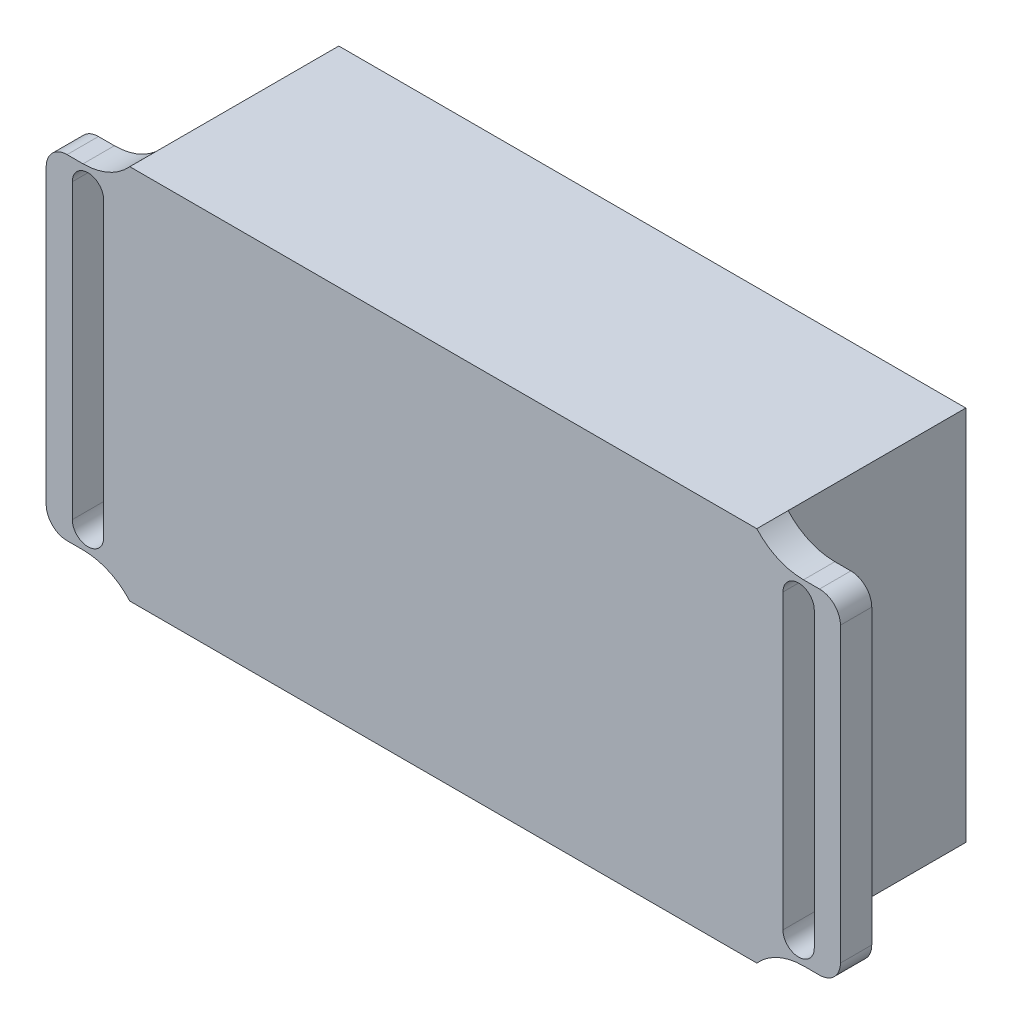
ISO-10303-21;
HEADER;
FILE_DESCRIPTION(('STEP AP214'),'2;1');
FILE_NAME('part.step','',(''),(''),'','','');
FILE_SCHEMA(('AUTOMOTIVE_DESIGN { 1 0 10303 214 1 1 1 1 }'));
ENDSEC;
DATA;
#1=APPLICATION_CONTEXT('core data for automotive mechanical design processes');
#2=APPLICATION_PROTOCOL_DEFINITION('international standard','automotive_design',2000,#1);
#3=PRODUCT_CONTEXT('',#1,'mechanical');
#4=PRODUCT('Part','Part','',(#3));
#5=PRODUCT_RELATED_PRODUCT_CATEGORY('part','',(#4));
#6=PRODUCT_DEFINITION_FORMATION('','',#4);
#7=PRODUCT_DEFINITION_CONTEXT('part definition',#1,'design');
#8=PRODUCT_DEFINITION('design','',#6,#7);
#9=PRODUCT_DEFINITION_SHAPE('','',#8);
#10=(LENGTH_UNIT() NAMED_UNIT(*) SI_UNIT(.MILLI.,.METRE.));
#11=(NAMED_UNIT(*) PLANE_ANGLE_UNIT() SI_UNIT($,.RADIAN.));
#12=(NAMED_UNIT(*) SI_UNIT($,.STERADIAN.) SOLID_ANGLE_UNIT());
#13=UNCERTAINTY_MEASURE_WITH_UNIT(LENGTH_MEASURE(1.E-05),#10,'distance_accuracy_value','');
#14=(GEOMETRIC_REPRESENTATION_CONTEXT(3) GLOBAL_UNCERTAINTY_ASSIGNED_CONTEXT((#13)) GLOBAL_UNIT_ASSIGNED_CONTEXT((#10,
#11,#12)) REPRESENTATION_CONTEXT('',''));
#15=CARTESIAN_POINT('',(0.,0.,0.));
#16=DIRECTION('',(0.,0.,1.));
#17=DIRECTION('',(1.,0.,0.));
#18=AXIS2_PLACEMENT_3D('',#15,#16,#17);
#19=CARTESIAN_POINT('',(0.,0.,0.));
#20=DIRECTION('',(0.,0.,1.));
#21=DIRECTION('',(1.,0.,0.));
#22=AXIS2_PLACEMENT_3D('',#19,#20,#21);
#23=PLANE('',#22);
#24=CARTESIAN_POINT('',(5.,0.,0.));
#25=DIRECTION('',(0.,0.,-1.));
#26=DIRECTION('',(1.,0.,0.));
#27=AXIS2_PLACEMENT_3D('',#24,#25,#26);
#28=CIRCLE('',#27,1.);
#29=CARTESIAN_POINT('',(6.,0.,0.));
#30=VERTEX_POINT('',#29);
#31=EDGE_CURVE('E399',#30,#30,#28,.T.);
#32=ORIENTED_EDGE('',*,*,#31,.F.);
#33=EDGE_LOOP('',(#32));
#34=FACE_BOUND('',#33,.T.);
#35=CARTESIAN_POINT('',(-5.,0.,0.));
#36=DIRECTION('',(0.,0.,-1.));
#37=DIRECTION('',(1.,0.,0.));
#38=AXIS2_PLACEMENT_3D('',#35,#36,#37);
#39=CIRCLE('',#38,1.);
#40=CARTESIAN_POINT('',(-4.,0.,0.));
#41=VERTEX_POINT('',#40);
#42=EDGE_CURVE('E393',#41,#41,#39,.T.);
#43=ORIENTED_EDGE('',*,*,#42,.F.);
#44=EDGE_LOOP('',(#43));
#45=FACE_BOUND('',#44,.T.);
#46=CARTESIAN_POINT('',(0.,0.,0.));
#47=DIRECTION('',(0.,0.,-1.));
#48=DIRECTION('',(1.,0.,0.));
#49=AXIS2_PLACEMENT_3D('',#46,#47,#48);
#50=CIRCLE('',#49,1.);
#51=CARTESIAN_POINT('',(1.,0.,0.));
#52=VERTEX_POINT('',#51);
#53=EDGE_CURVE('E394',#52,#52,#50,.T.);
#54=ORIENTED_EDGE('',*,*,#53,.F.);
#55=EDGE_LOOP('',(#54));
#56=FACE_BOUND('',#55,.T.);
#57=DIRECTION('',(1.,0.,0.));
#58=VECTOR('',#57,1.);
#59=CARTESIAN_POINT('',(6.,-18.,0.));
#60=LINE('',#59,#58);
#61=CARTESIAN_POINT('',(-30.,-18.,0.));
#62=VERTEX_POINT('',#61);
#63=CARTESIAN_POINT('',(30.,-18.,0.));
#64=VERTEX_POINT('',#63);
#65=EDGE_CURVE('E389',#62,#64,#60,.T.);
#66=ORIENTED_EDGE('',*,*,#65,.F.);
#67=DIRECTION('',(0.,-1.,0.));
#68=VECTOR('',#67,1.);
#69=CARTESIAN_POINT('',(-30.,-18.,0.));
#70=LINE('',#69,#68);
#71=CARTESIAN_POINT('',(-30.,18.,0.));
#72=VERTEX_POINT('',#71);
#73=EDGE_CURVE('E377',#72,#62,#70,.T.);
#74=ORIENTED_EDGE('',*,*,#73,.F.);
#75=DIRECTION('',(-1.,0.,0.));
#76=VECTOR('',#75,1.);
#77=CARTESIAN_POINT('',(-6.,18.,0.));
#78=LINE('',#77,#76);
#79=CARTESIAN_POINT('',(30.,18.,0.));
#80=VERTEX_POINT('',#79);
#81=EDGE_CURVE('E391',#80,#72,#78,.T.);
#82=ORIENTED_EDGE('',*,*,#81,.F.);
#83=DIRECTION('',(0.,1.,0.));
#84=VECTOR('',#83,1.);
#85=CARTESIAN_POINT('',(30.,18.,0.));
#86=LINE('',#85,#84);
#87=EDGE_CURVE('E365',#64,#80,#86,.T.);
#88=ORIENTED_EDGE('',*,*,#87,.F.);
#89=EDGE_LOOP('',(#66,#74,#82,#88));
#90=FACE_BOUND('',#89,.T.);
#91=ADVANCED_FACE('F49',(#34,#45,#56,#90),#23,.F.);
#92=CARTESIAN_POINT('',(5.,0.,0.));
#93=DIRECTION('',(0.,0.,-1.));
#94=DIRECTION('',(-1.,-6.080797825879E-09,0.));
#95=AXIS2_PLACEMENT_3D('',#92,#93,#94);
#96=SPHERICAL_SURFACE('',#95,1.);
#97=ORIENTED_EDGE('',*,*,#31,.T.);
#98=EDGE_LOOP('',(#97));
#99=FACE_BOUND('',#98,.T.);
#100=ADVANCED_FACE('F774',(#99),#96,.T.);
#101=CARTESIAN_POINT('',(0.,0.,0.));
#102=DIRECTION('',(0.,0.,-1.));
#103=DIRECTION('',(-1.,-6.080797832818E-09,0.));
#104=AXIS2_PLACEMENT_3D('',#101,#102,#103);
#105=SPHERICAL_SURFACE('',#104,1.);
#106=ORIENTED_EDGE('',*,*,#53,.T.);
#107=EDGE_LOOP('',(#106));
#108=FACE_BOUND('',#107,.T.);
#109=ADVANCED_FACE('F780',(#108),#105,.T.);
#110=CARTESIAN_POINT('',(-5.,0.,0.));
#111=DIRECTION('',(0.,0.,-1.));
#112=DIRECTION('',(-1.,-6.080797763426E-09,0.));
#113=AXIS2_PLACEMENT_3D('',#110,#111,#112);
#114=SPHERICAL_SURFACE('',#113,1.);
#115=ORIENTED_EDGE('',*,*,#42,.T.);
#116=EDGE_LOOP('',(#115));
#117=FACE_BOUND('',#116,.T.);
#118=ADVANCED_FACE('F788',(#117),#114,.T.);
#119=CARTESIAN_POINT('',(0.,18.,0.));
#120=DIRECTION('',(0.,-1.,0.));
#121=DIRECTION('',(0.,0.,-1.));
#122=AXIS2_PLACEMENT_3D('',#119,#120,#121);
#123=PLANE('',#122);
#124=ORIENTED_EDGE('',*,*,#81,.T.);
#125=DIRECTION('',(0.,0.,-1.));
#126=VECTOR('',#125,1.);
#127=CARTESIAN_POINT('',(-30.,18.,0.));
#128=LINE('',#127,#126);
#129=CARTESIAN_POINT('',(-30.,18.,17.));
#130=VERTEX_POINT('',#129);
#131=EDGE_CURVE('E386',#130,#72,#128,.T.);
#132=ORIENTED_EDGE('',*,*,#131,.F.);
#133=DIRECTION('',(0.,0.,-1.));
#134=VECTOR('',#133,1.);
#135=CARTESIAN_POINT('',(-30.,18.,20.));
#136=LINE('',#135,#134);
#137=CARTESIAN_POINT('',(-30.,18.,20.));
#138=VERTEX_POINT('',#137);
#139=EDGE_CURVE('E318',#138,#130,#136,.T.);
#140=ORIENTED_EDGE('',*,*,#139,.F.);
#141=DIRECTION('',(-1.,0.,0.));
#142=VECTOR('',#141,1.);
#143=CARTESIAN_POINT('',(-30.,18.,20.));
#144=LINE('',#143,#142);
#145=CARTESIAN_POINT('',(30.0000000000001,18.0000000000001,20.));
#146=VERTEX_POINT('',#145);
#147=EDGE_CURVE('E316',#146,#138,#144,.T.);
#148=ORIENTED_EDGE('',*,*,#147,.F.);
#149=DIRECTION('',(0.,0.,-1.));
#150=VECTOR('',#149,1.);
#151=CARTESIAN_POINT('',(30.0000000000001,18.0000000000001,20.));
#152=LINE('',#151,#150);
#153=CARTESIAN_POINT('',(30.0000000000001,18.0000000000001,17.));
#154=VERTEX_POINT('',#153);
#155=EDGE_CURVE('E344',#146,#154,#152,.T.);
#156=ORIENTED_EDGE('',*,*,#155,.T.);
#157=DIRECTION('',(0.,0.,1.));
#158=VECTOR('',#157,1.);
#159=CARTESIAN_POINT('',(30.,18.,17.));
#160=LINE('',#159,#158);
#161=EDGE_CURVE('E368',#80,#154,#160,.T.);
#162=ORIENTED_EDGE('',*,*,#161,.F.);
#163=EDGE_LOOP('',(#124,#132,#140,#148,#156,#162));
#164=FACE_BOUND('',#163,.T.);
#165=ADVANCED_FACE('F790',(#164),#123,.F.);
#166=CARTESIAN_POINT('',(0.,-18.,0.));
#167=DIRECTION('',(0.,1.,0.));
#168=DIRECTION('',(0.,0.,1.));
#169=AXIS2_PLACEMENT_3D('',#166,#167,#168);
#170=PLANE('',#169);
#171=DIRECTION('',(0.,0.,-1.));
#172=VECTOR('',#171,1.);
#173=CARTESIAN_POINT('',(30.,-18.,0.));
#174=LINE('',#173,#172);
#175=CARTESIAN_POINT('',(30.,-18.,17.));
#176=VERTEX_POINT('',#175);
#177=EDGE_CURVE('E374',#176,#64,#174,.T.);
#178=ORIENTED_EDGE('',*,*,#177,.F.);
#179=DIRECTION('',(0.,0.,-1.));
#180=VECTOR('',#179,1.);
#181=CARTESIAN_POINT('',(30.,-18.,20.));
#182=LINE('',#181,#180);
#183=CARTESIAN_POINT('',(30.,-18.,20.));
#184=VERTEX_POINT('',#183);
#185=EDGE_CURVE('E353',#184,#176,#182,.T.);
#186=ORIENTED_EDGE('',*,*,#185,.F.);
#187=DIRECTION('',(1.,0.,0.));
#188=VECTOR('',#187,1.);
#189=CARTESIAN_POINT('',(30.,-18.,20.));
#190=LINE('',#189,#188);
#191=CARTESIAN_POINT('',(-30.0000000000001,-18.0000000000001,20.));
#192=VERTEX_POINT('',#191);
#193=EDGE_CURVE('E302',#192,#184,#190,.T.);
#194=ORIENTED_EDGE('',*,*,#193,.F.);
#195=DIRECTION('',(0.,0.,-1.));
#196=VECTOR('',#195,1.);
#197=CARTESIAN_POINT('',(-30.0000000000001,-18.0000000000001,20.));
#198=LINE('',#197,#196);
#199=CARTESIAN_POINT('',(-30.0000000000001,-18.0000000000001,17.));
#200=VERTEX_POINT('',#199);
#201=EDGE_CURVE('E356',#192,#200,#198,.T.);
#202=ORIENTED_EDGE('',*,*,#201,.T.);
#203=DIRECTION('',(0.,0.,1.));
#204=VECTOR('',#203,1.);
#205=CARTESIAN_POINT('',(-30.,-18.,17.));
#206=LINE('',#205,#204);
#207=EDGE_CURVE('E380',#62,#200,#206,.T.);
#208=ORIENTED_EDGE('',*,*,#207,.F.);
#209=ORIENTED_EDGE('',*,*,#65,.T.);
#210=EDGE_LOOP('',(#178,#186,#194,#202,#208,#209));
#211=FACE_BOUND('',#210,.T.);
#212=ADVANCED_FACE('F740',(#211),#170,.F.);
#213=CARTESIAN_POINT('',(-30.,0.,0.));
#214=DIRECTION('',(1.,0.,0.));
#215=DIRECTION('',(0.,0.,-1.));
#216=AXIS2_PLACEMENT_3D('',#213,#214,#215);
#217=PLANE('',#216);
#218=ORIENTED_EDGE('',*,*,#73,.T.);
#219=ORIENTED_EDGE('',*,*,#207,.T.);
#220=DIRECTION('',(0.,1.,0.));
#221=VECTOR('',#220,1.);
#222=CARTESIAN_POINT('',(-30.,18.,17.));
#223=LINE('',#222,#221);
#224=EDGE_CURVE('E383',#200,#130,#223,.T.);
#225=ORIENTED_EDGE('',*,*,#224,.T.);
#226=ORIENTED_EDGE('',*,*,#131,.T.);
#227=EDGE_LOOP('',(#218,#219,#225,#226));
#228=FACE_BOUND('',#227,.T.);
#229=ADVANCED_FACE('F1016',(#228),#217,.F.);
#230=CARTESIAN_POINT('',(30.,0.,0.));
#231=DIRECTION('',(-1.,0.,0.));
#232=DIRECTION('',(0.,0.,1.));
#233=AXIS2_PLACEMENT_3D('',#230,#231,#232);
#234=PLANE('',#233);
#235=ORIENTED_EDGE('',*,*,#87,.T.);
#236=ORIENTED_EDGE('',*,*,#161,.T.);
#237=DIRECTION('',(0.,-1.,0.));
#238=VECTOR('',#237,1.);
#239=CARTESIAN_POINT('',(30.,-18.,17.));
#240=LINE('',#239,#238);
#241=EDGE_CURVE('E371',#154,#176,#240,.T.);
#242=ORIENTED_EDGE('',*,*,#241,.T.);
#243=ORIENTED_EDGE('',*,*,#177,.T.);
#244=EDGE_LOOP('',(#235,#236,#242,#243));
#245=FACE_BOUND('',#244,.T.);
#246=ADVANCED_FACE('F1006',(#245),#234,.F.);
#247=CARTESIAN_POINT('',(-34.472135955,22.,17.));
#248=DIRECTION('',(0.,0.,1.));
#249=DIRECTION('',(1.,0.,0.));
#250=AXIS2_PLACEMENT_3D('',#247,#248,#249);
#251=PLANE('',#250);
#252=DIRECTION('',(0.,-1.,0.));
#253=VECTOR('',#252,1.);
#254=CARTESIAN_POINT('',(-35.5,22.,17.));
#255=LINE('',#254,#253);
#256=CARTESIAN_POINT('',(-35.5,14.,17.));
#257=VERTEX_POINT('',#256);
#258=CARTESIAN_POINT('',(-35.5,-14.,17.));
#259=VERTEX_POINT('',#258);
#260=EDGE_CURVE('E261',#257,#259,#255,.T.);
#261=ORIENTED_EDGE('',*,*,#260,.T.);
#262=CARTESIAN_POINT('',(-34.,-14.,17.));
#263=DIRECTION('',(0.,0.,1.));
#264=DIRECTION('',(1.,0.,0.));
#265=AXIS2_PLACEMENT_3D('',#262,#263,#264);
#266=CIRCLE('',#265,1.5);
#267=CARTESIAN_POINT('',(-32.5,-14.,17.));
#268=VERTEX_POINT('',#267);
#269=EDGE_CURVE('E264',#259,#268,#266,.T.);
#270=ORIENTED_EDGE('',*,*,#269,.T.);
#271=DIRECTION('',(0.,1.,0.));
#272=VECTOR('',#271,1.);
#273=CARTESIAN_POINT('',(-32.5,22.,17.));
#274=LINE('',#273,#272);
#275=CARTESIAN_POINT('',(-32.5,14.,17.));
#276=VERTEX_POINT('',#275);
#277=EDGE_CURVE('E256',#268,#276,#274,.T.);
#278=ORIENTED_EDGE('',*,*,#277,.T.);
#279=CARTESIAN_POINT('',(-34.,14.,17.));
#280=DIRECTION('',(0.,0.,1.));
#281=DIRECTION('',(1.,0.,0.));
#282=AXIS2_PLACEMENT_3D('',#279,#280,#281);
#283=CIRCLE('',#282,1.5);
#284=EDGE_CURVE('E231',#276,#257,#283,.T.);
#285=ORIENTED_EDGE('',*,*,#284,.T.);
#286=EDGE_LOOP('',(#261,#270,#278,#285));
#287=FACE_BOUND('',#286,.T.);
#288=DIRECTION('',(1.,0.,0.));
#289=VECTOR('',#288,1.);
#290=CARTESIAN_POINT('',(-34.472135955,-16.,17.));
#291=LINE('',#290,#289);
#292=CARTESIAN_POINT('',(-36.,-16.,17.));
#293=VERTEX_POINT('',#292);
#294=CARTESIAN_POINT('',(-34.472135955,-16.,17.));
#295=VERTEX_POINT('',#294);
#296=EDGE_CURVE('E327',#293,#295,#291,.T.);
#297=ORIENTED_EDGE('',*,*,#296,.F.);
#298=CARTESIAN_POINT('',(-36.,-14.,17.));
#299=DIRECTION('',(0.,0.,1.));
#300=DIRECTION('',(1.,0.,0.));
#301=AXIS2_PLACEMENT_3D('',#298,#299,#300);
#302=CIRCLE('',#301,2.);
#303=CARTESIAN_POINT('',(-38.,-14.,17.));
#304=VERTEX_POINT('',#303);
#305=EDGE_CURVE('E681',#293,#304,#302,.F.);
#306=ORIENTED_EDGE('',*,*,#305,.T.);
#307=DIRECTION('',(0.,-1.,0.));
#308=VECTOR('',#307,1.);
#309=CARTESIAN_POINT('',(-38.,-16.,17.));
#310=LINE('',#309,#308);
#311=CARTESIAN_POINT('',(-38.,14.,17.));
#312=VERTEX_POINT('',#311);
#313=EDGE_CURVE('E324',#312,#304,#310,.T.);
#314=ORIENTED_EDGE('',*,*,#313,.F.);
#315=CARTESIAN_POINT('',(-36.,14.,17.));
#316=DIRECTION('',(0.,0.,1.));
#317=DIRECTION('',(1.,0.,0.));
#318=AXIS2_PLACEMENT_3D('',#315,#316,#317);
#319=CIRCLE('',#318,2.);
#320=CARTESIAN_POINT('',(-36.,16.,17.));
#321=VERTEX_POINT('',#320);
#322=EDGE_CURVE('E679',#312,#321,#319,.F.);
#323=ORIENTED_EDGE('',*,*,#322,.T.);
#324=DIRECTION('',(-1.,0.,0.));
#325=VECTOR('',#324,1.);
#326=CARTESIAN_POINT('',(-38.,16.,17.));
#327=LINE('',#326,#325);
#328=CARTESIAN_POINT('',(-34.472135955,16.,17.));
#329=VERTEX_POINT('',#328);
#330=EDGE_CURVE('E321',#329,#321,#327,.T.);
#331=ORIENTED_EDGE('',*,*,#330,.F.);
#332=CARTESIAN_POINT('',(-34.472135955,22.,17.));
#333=DIRECTION('',(0.,0.,-1.));
#334=DIRECTION('',(1.,0.,0.));
#335=AXIS2_PLACEMENT_3D('',#332,#333,#334);
#336=CIRCLE('',#335,6.00000000000015);
#337=EDGE_CURVE('E281',#130,#329,#336,.T.);
#338=ORIENTED_EDGE('',*,*,#337,.F.);
#339=ORIENTED_EDGE('',*,*,#224,.F.);
#340=CARTESIAN_POINT('',(-34.472135955,-22.,17.));
#341=DIRECTION('',(0.,0.,-1.));
#342=DIRECTION('',(1.,0.,0.));
#343=AXIS2_PLACEMENT_3D('',#340,#341,#342);
#344=CIRCLE('',#343,6.00000000000015);
#345=EDGE_CURVE('E329',#295,#200,#344,.T.);
#346=ORIENTED_EDGE('',*,*,#345,.F.);
#347=EDGE_LOOP('',(#297,#306,#314,#323,#331,#338,#339,#346));
#348=FACE_BOUND('',#347,.T.);
#349=ADVANCED_FACE('F721',(#287,#348),#251,.F.);
#350=CARTESIAN_POINT('',(-34.472135955,22.,20.));
#351=DIRECTION('',(0.,0.,-1.));
#352=DIRECTION('',(-1.,0.,0.));
#353=AXIS2_PLACEMENT_3D('',#350,#351,#352);
#354=CYLINDRICAL_SURFACE('',#353,6.00000000000015);
#355=ORIENTED_EDGE('',*,*,#337,.T.);
#356=DIRECTION('',(0.,0.,-1.));
#357=VECTOR('',#356,1.);
#358=CARTESIAN_POINT('',(-34.472135955,16.,20.));
#359=LINE('',#358,#357);
#360=CARTESIAN_POINT('',(-34.472135955,16.,20.));
#361=VERTEX_POINT('',#360);
#362=EDGE_CURVE('E362',#361,#329,#359,.T.);
#363=ORIENTED_EDGE('',*,*,#362,.F.);
#364=CARTESIAN_POINT('',(-34.472135955,22.,20.));
#365=DIRECTION('',(0.,0.,-1.));
#366=DIRECTION('',(1.,0.,0.));
#367=AXIS2_PLACEMENT_3D('',#364,#365,#366);
#368=CIRCLE('',#367,6.00000000000015);
#369=EDGE_CURVE('E288',#138,#361,#368,.T.);
#370=ORIENTED_EDGE('',*,*,#369,.F.);
#371=ORIENTED_EDGE('',*,*,#139,.T.);
#372=EDGE_LOOP('',(#355,#363,#370,#371));
#373=FACE_BOUND('',#372,.T.);
#374=ADVANCED_FACE('F988',(#373),#354,.F.);
#375=CARTESIAN_POINT('',(-38.,16.,20.));
#376=DIRECTION('',(0.,-1.,0.));
#377=DIRECTION('',(0.,0.,-1.));
#378=AXIS2_PLACEMENT_3D('',#375,#376,#377);
#379=PLANE('',#378);
#380=ORIENTED_EDGE('',*,*,#330,.T.);
#381=DIRECTION('',(0.,0.,-1.));
#382=VECTOR('',#381,1.);
#383=CARTESIAN_POINT('',(-36.,16.,20.));
#384=LINE('',#383,#382);
#385=CARTESIAN_POINT('',(-36.,16.,20.));
#386=VERTEX_POINT('',#385);
#387=EDGE_CURVE('E57',#321,#386,#384,.F.);
#388=ORIENTED_EDGE('',*,*,#387,.T.);
#389=DIRECTION('',(-1.,0.,0.));
#390=VECTOR('',#389,1.);
#391=CARTESIAN_POINT('',(-38.,16.,20.));
#392=LINE('',#391,#390);
#393=EDGE_CURVE('E291',#361,#386,#392,.T.);
#394=ORIENTED_EDGE('',*,*,#393,.F.);
#395=ORIENTED_EDGE('',*,*,#362,.T.);
#396=EDGE_LOOP('',(#380,#388,#394,#395));
#397=FACE_BOUND('',#396,.T.);
#398=ADVANCED_FACE('F706',(#397),#379,.F.);
#399=CARTESIAN_POINT('',(-38.,-16.,20.));
#400=DIRECTION('',(1.,0.,0.));
#401=DIRECTION('',(0.,0.,-1.));
#402=AXIS2_PLACEMENT_3D('',#399,#400,#401);
#403=PLANE('',#402);
#404=ORIENTED_EDGE('',*,*,#313,.T.);
#405=DIRECTION('',(0.,0.,-1.));
#406=VECTOR('',#405,1.);
#407=CARTESIAN_POINT('',(-38.,-14.,20.));
#408=LINE('',#407,#406);
#409=CARTESIAN_POINT('',(-38.,-14.,20.));
#410=VERTEX_POINT('',#409);
#411=EDGE_CURVE('E686',#304,#410,#408,.F.);
#412=ORIENTED_EDGE('',*,*,#411,.T.);
#413=DIRECTION('',(0.,-1.,0.));
#414=VECTOR('',#413,1.);
#415=CARTESIAN_POINT('',(-38.,-16.,20.));
#416=LINE('',#415,#414);
#417=CARTESIAN_POINT('',(-38.,14.,20.));
#418=VERTEX_POINT('',#417);
#419=EDGE_CURVE('E295',#418,#410,#416,.T.);
#420=ORIENTED_EDGE('',*,*,#419,.F.);
#421=DIRECTION('',(0.,0.,-1.));
#422=VECTOR('',#421,1.);
#423=CARTESIAN_POINT('',(-38.,14.,20.));
#424=LINE('',#423,#422);
#425=EDGE_CURVE('E683',#418,#312,#424,.T.);
#426=ORIENTED_EDGE('',*,*,#425,.T.);
#427=EDGE_LOOP('',(#404,#412,#420,#426));
#428=FACE_BOUND('',#427,.T.);
#429=ADVANCED_FACE('F717',(#428),#403,.F.);
#430=CARTESIAN_POINT('',(-34.472135955,-16.,20.));
#431=DIRECTION('',(0.,1.,0.));
#432=DIRECTION('',(0.,0.,1.));
#433=AXIS2_PLACEMENT_3D('',#430,#431,#432);
#434=PLANE('',#433);
#435=DIRECTION('',(1.,0.,0.));
#436=VECTOR('',#435,1.);
#437=CARTESIAN_POINT('',(-34.472135955,-16.,20.));
#438=LINE('',#437,#436);
#439=CARTESIAN_POINT('',(-36.,-16.,20.));
#440=VERTEX_POINT('',#439);
#441=CARTESIAN_POINT('',(-34.472135955,-16.,20.));
#442=VERTEX_POINT('',#441);
#443=EDGE_CURVE('E298',#440,#442,#438,.T.);
#444=ORIENTED_EDGE('',*,*,#443,.F.);
#445=DIRECTION('',(0.,0.,-1.));
#446=VECTOR('',#445,1.);
#447=CARTESIAN_POINT('',(-36.,-16.,20.));
#448=LINE('',#447,#446);
#449=EDGE_CURVE('E676',#440,#293,#448,.T.);
#450=ORIENTED_EDGE('',*,*,#449,.T.);
#451=ORIENTED_EDGE('',*,*,#296,.T.);
#452=DIRECTION('',(0.,0.,-1.));
#453=VECTOR('',#452,1.);
#454=CARTESIAN_POINT('',(-34.472135955,-16.,20.));
#455=LINE('',#454,#453);
#456=EDGE_CURVE('E359',#442,#295,#455,.T.);
#457=ORIENTED_EDGE('',*,*,#456,.F.);
#458=EDGE_LOOP('',(#444,#450,#451,#457));
#459=FACE_BOUND('',#458,.T.);
#460=ADVANCED_FACE('F729',(#459),#434,.F.);
#461=CARTESIAN_POINT('',(-34.472135955,-22.,20.));
#462=DIRECTION('',(0.,0.,-1.));
#463=DIRECTION('',(-1.,0.,0.));
#464=AXIS2_PLACEMENT_3D('',#461,#462,#463);
#465=CYLINDRICAL_SURFACE('',#464,6.00000000000015);
#466=ORIENTED_EDGE('',*,*,#345,.T.);
#467=ORIENTED_EDGE('',*,*,#201,.F.);
#468=CARTESIAN_POINT('',(-34.472135955,-22.,20.));
#469=DIRECTION('',(0.,0.,-1.));
#470=DIRECTION('',(1.,0.,0.));
#471=AXIS2_PLACEMENT_3D('',#468,#469,#470);
#472=CIRCLE('',#471,6.00000000000015);
#473=EDGE_CURVE('E300',#442,#192,#472,.T.);
#474=ORIENTED_EDGE('',*,*,#473,.F.);
#475=ORIENTED_EDGE('',*,*,#456,.T.);
#476=EDGE_LOOP('',(#466,#467,#474,#475));
#477=FACE_BOUND('',#476,.T.);
#478=ADVANCED_FACE('F736',(#477),#465,.F.);
#479=CARTESIAN_POINT('',(34.472135955,-22.,20.));
#480=DIRECTION('',(0.,0.,-1.));
#481=DIRECTION('',(-1.,0.,0.));
#482=AXIS2_PLACEMENT_3D('',#479,#480,#481);
#483=CYLINDRICAL_SURFACE('',#482,6.00000000000015);
#484=CARTESIAN_POINT('',(34.472135955,-22.,17.));
#485=DIRECTION('',(0.,0.,-1.));
#486=DIRECTION('',(1.,0.,0.));
#487=AXIS2_PLACEMENT_3D('',#484,#485,#486);
#488=CIRCLE('',#487,6.00000000000015);
#489=CARTESIAN_POINT('',(34.472135955,-15.9999999999998,17.));
#490=VERTEX_POINT('',#489);
#491=EDGE_CURVE('E332',#176,#490,#488,.T.);
#492=ORIENTED_EDGE('',*,*,#491,.T.);
#493=DIRECTION('',(0.,0.,-1.));
#494=VECTOR('',#493,1.);
#495=CARTESIAN_POINT('',(34.472135955,-15.9999999999998,20.));
#496=LINE('',#495,#494);
#497=CARTESIAN_POINT('',(34.472135955,-15.9999999999998,20.));
#498=VERTEX_POINT('',#497);
#499=EDGE_CURVE('E350',#498,#490,#496,.T.);
#500=ORIENTED_EDGE('',*,*,#499,.F.);
#501=CARTESIAN_POINT('',(34.472135955,-22.,20.));
#502=DIRECTION('',(0.,0.,-1.));
#503=DIRECTION('',(1.,0.,0.));
#504=AXIS2_PLACEMENT_3D('',#501,#502,#503);
#505=CIRCLE('',#504,6.00000000000015);
#506=EDGE_CURVE('E304',#184,#498,#505,.T.);
#507=ORIENTED_EDGE('',*,*,#506,.F.);
#508=ORIENTED_EDGE('',*,*,#185,.T.);
#509=EDGE_LOOP('',(#492,#500,#507,#508));
#510=FACE_BOUND('',#509,.T.);
#511=ADVANCED_FACE('F744',(#510),#483,.F.);
#512=CARTESIAN_POINT('',(38.,-16.,20.));
#513=DIRECTION('',(0.,1.,0.));
#514=DIRECTION('',(0.,0.,1.));
#515=AXIS2_PLACEMENT_3D('',#512,#513,#514);
#516=PLANE('',#515);
#517=DIRECTION('',(1.,0.,0.));
#518=VECTOR('',#517,1.);
#519=CARTESIAN_POINT('',(38.,-16.,17.));
#520=LINE('',#519,#518);
#521=CARTESIAN_POINT('',(36.,-16.,17.));
#522=VERTEX_POINT('',#521);
#523=EDGE_CURVE('E334',#490,#522,#520,.T.);
#524=ORIENTED_EDGE('',*,*,#523,.T.);
#525=DIRECTION('',(0.,0.,-1.));
#526=VECTOR('',#525,1.);
#527=CARTESIAN_POINT('',(36.,-16.,20.));
#528=LINE('',#527,#526);
#529=CARTESIAN_POINT('',(36.,-16.,20.));
#530=VERTEX_POINT('',#529);
#531=EDGE_CURVE('E703',#522,#530,#528,.F.);
#532=ORIENTED_EDGE('',*,*,#531,.T.);
#533=DIRECTION('',(1.,0.,0.));
#534=VECTOR('',#533,1.);
#535=CARTESIAN_POINT('',(38.,-16.,20.));
#536=LINE('',#535,#534);
#537=EDGE_CURVE('E306',#498,#530,#536,.T.);
#538=ORIENTED_EDGE('',*,*,#537,.F.);
#539=ORIENTED_EDGE('',*,*,#499,.T.);
#540=EDGE_LOOP('',(#524,#532,#538,#539));
#541=FACE_BOUND('',#540,.T.);
#542=ADVANCED_FACE('F939',(#541),#516,.F.);
#543=CARTESIAN_POINT('',(38.,16.,20.));
#544=DIRECTION('',(-1.,0.,0.));
#545=DIRECTION('',(0.,0.,1.));
#546=AXIS2_PLACEMENT_3D('',#543,#544,#545);
#547=PLANE('',#546);
#548=DIRECTION('',(0.,1.,0.));
#549=VECTOR('',#548,1.);
#550=CARTESIAN_POINT('',(38.,16.,20.));
#551=LINE('',#550,#549);
#552=CARTESIAN_POINT('',(38.,-14.,20.));
#553=VERTEX_POINT('',#552);
#554=CARTESIAN_POINT('',(38.,14.,20.));
#555=VERTEX_POINT('',#554);
#556=EDGE_CURVE('E309',#553,#555,#551,.T.);
#557=ORIENTED_EDGE('',*,*,#556,.F.);
#558=DIRECTION('',(0.,0.,-1.));
#559=VECTOR('',#558,1.);
#560=CARTESIAN_POINT('',(38.,-14.,20.));
#561=LINE('',#560,#559);
#562=CARTESIAN_POINT('',(38.,-14.,17.));
#563=VERTEX_POINT('',#562);
#564=EDGE_CURVE('E698',#553,#563,#561,.T.);
#565=ORIENTED_EDGE('',*,*,#564,.T.);
#566=DIRECTION('',(0.,1.,0.));
#567=VECTOR('',#566,1.);
#568=CARTESIAN_POINT('',(38.,16.,17.));
#569=LINE('',#568,#567);
#570=CARTESIAN_POINT('',(38.,14.,17.));
#571=VERTEX_POINT('',#570);
#572=EDGE_CURVE('E336',#563,#571,#569,.T.);
#573=ORIENTED_EDGE('',*,*,#572,.T.);
#574=DIRECTION('',(0.,0.,-1.));
#575=VECTOR('',#574,1.);
#576=CARTESIAN_POINT('',(38.,14.,20.));
#577=LINE('',#576,#575);
#578=EDGE_CURVE('E696',#571,#555,#577,.F.);
#579=ORIENTED_EDGE('',*,*,#578,.T.);
#580=EDGE_LOOP('',(#557,#565,#573,#579));
#581=FACE_BOUND('',#580,.T.);
#582=ADVANCED_FACE('F754',(#581),#547,.F.);
#583=CARTESIAN_POINT('',(34.472135955,16.,20.));
#584=DIRECTION('',(0.,-1.,0.));
#585=DIRECTION('',(0.,0.,-1.));
#586=AXIS2_PLACEMENT_3D('',#583,#584,#585);
#587=PLANE('',#586);
#588=DIRECTION('',(-1.,0.,0.));
#589=VECTOR('',#588,1.);
#590=CARTESIAN_POINT('',(34.472135955,16.,20.));
#591=LINE('',#590,#589);
#592=CARTESIAN_POINT('',(36.,16.,20.));
#593=VERTEX_POINT('',#592);
#594=CARTESIAN_POINT('',(34.472135955,16.,20.));
#595=VERTEX_POINT('',#594);
#596=EDGE_CURVE('E312',#593,#595,#591,.T.);
#597=ORIENTED_EDGE('',*,*,#596,.F.);
#598=DIRECTION('',(0.,0.,-1.));
#599=VECTOR('',#598,1.);
#600=CARTESIAN_POINT('',(36.,16.,20.));
#601=LINE('',#600,#599);
#602=CARTESIAN_POINT('',(36.,16.,17.));
#603=VERTEX_POINT('',#602);
#604=EDGE_CURVE('E12',#593,#603,#601,.T.);
#605=ORIENTED_EDGE('',*,*,#604,.T.);
#606=DIRECTION('',(-1.,0.,0.));
#607=VECTOR('',#606,1.);
#608=CARTESIAN_POINT('',(34.472135955,16.,17.));
#609=LINE('',#608,#607);
#610=CARTESIAN_POINT('',(34.472135955,16.,17.));
#611=VERTEX_POINT('',#610);
#612=EDGE_CURVE('E339',#603,#611,#609,.T.);
#613=ORIENTED_EDGE('',*,*,#612,.T.);
#614=DIRECTION('',(0.,0.,-1.));
#615=VECTOR('',#614,1.);
#616=CARTESIAN_POINT('',(34.472135955,16.,20.));
#617=LINE('',#616,#615);
#618=EDGE_CURVE('E347',#595,#611,#617,.T.);
#619=ORIENTED_EDGE('',*,*,#618,.F.);
#620=EDGE_LOOP('',(#597,#605,#613,#619));
#621=FACE_BOUND('',#620,.T.);
#622=ADVANCED_FACE('F761',(#621),#587,.F.);
#623=CARTESIAN_POINT('',(34.472135955,22.,20.));
#624=DIRECTION('',(0.,0.,-1.));
#625=DIRECTION('',(-1.,0.,0.));
#626=AXIS2_PLACEMENT_3D('',#623,#624,#625);
#627=CYLINDRICAL_SURFACE('',#626,6.00000000000015);
#628=CARTESIAN_POINT('',(34.472135955,22.,17.));
#629=DIRECTION('',(0.,0.,-1.));
#630=DIRECTION('',(1.,0.,0.));
#631=AXIS2_PLACEMENT_3D('',#628,#629,#630);
#632=CIRCLE('',#631,6.00000000000015);
#633=EDGE_CURVE('E292',#611,#154,#632,.T.);
#634=ORIENTED_EDGE('',*,*,#633,.T.);
#635=ORIENTED_EDGE('',*,*,#155,.F.);
#636=CARTESIAN_POINT('',(34.472135955,22.,20.));
#637=DIRECTION('',(0.,0.,-1.));
#638=DIRECTION('',(1.,0.,0.));
#639=AXIS2_PLACEMENT_3D('',#636,#637,#638);
#640=CIRCLE('',#639,6.00000000000015);
#641=EDGE_CURVE('E314',#595,#146,#640,.T.);
#642=ORIENTED_EDGE('',*,*,#641,.F.);
#643=ORIENTED_EDGE('',*,*,#618,.T.);
#644=EDGE_LOOP('',(#634,#635,#642,#643));
#645=FACE_BOUND('',#644,.T.);
#646=ADVANCED_FACE('F764',(#645),#627,.F.);
#647=CARTESIAN_POINT('',(-34.472135955,22.,20.));
#648=DIRECTION('',(0.,0.,1.));
#649=DIRECTION('',(1.,0.,0.));
#650=AXIS2_PLACEMENT_3D('',#647,#648,#649);
#651=PLANE('',#650);
#652=CARTESIAN_POINT('',(-34.,-14.,20.));
#653=DIRECTION('',(0.,0.,1.));
#654=DIRECTION('',(1.,0.,0.));
#655=AXIS2_PLACEMENT_3D('',#652,#653,#654);
#656=CIRCLE('',#655,1.5);
#657=CARTESIAN_POINT('',(-35.5,-14.,20.));
#658=VERTEX_POINT('',#657);
#659=CARTESIAN_POINT('',(-32.5,-14.,20.));
#660=VERTEX_POINT('',#659);
#661=EDGE_CURVE('E244',#658,#660,#656,.T.);
#662=ORIENTED_EDGE('',*,*,#661,.F.);
#663=DIRECTION('',(0.,-1.,0.));
#664=VECTOR('',#663,1.);
#665=CARTESIAN_POINT('',(-35.5,14.,20.));
#666=LINE('',#665,#664);
#667=CARTESIAN_POINT('',(-35.5,14.,20.));
#668=VERTEX_POINT('',#667);
#669=EDGE_CURVE('E249',#668,#658,#666,.T.);
#670=ORIENTED_EDGE('',*,*,#669,.F.);
#671=CARTESIAN_POINT('',(-34.,14.,20.));
#672=DIRECTION('',(0.,0.,1.));
#673=DIRECTION('',(1.,0.,0.));
#674=AXIS2_PLACEMENT_3D('',#671,#672,#673);
#675=CIRCLE('',#674,1.5);
#676=CARTESIAN_POINT('',(-32.5,14.,20.));
#677=VERTEX_POINT('',#676);
#678=EDGE_CURVE('E228',#677,#668,#675,.T.);
#679=ORIENTED_EDGE('',*,*,#678,.F.);
#680=DIRECTION('',(0.,1.,0.));
#681=VECTOR('',#680,1.);
#682=CARTESIAN_POINT('',(-32.5,-14.,20.));
#683=LINE('',#682,#681);
#684=EDGE_CURVE('E239',#660,#677,#683,.T.);
#685=ORIENTED_EDGE('',*,*,#684,.F.);
#686=EDGE_LOOP('',(#662,#670,#679,#685));
#687=FACE_BOUND('',#686,.T.);
#688=CARTESIAN_POINT('',(34.,14.,20.));
#689=DIRECTION('',(0.,0.,1.));
#690=DIRECTION('',(1.,0.,0.));
#691=AXIS2_PLACEMENT_3D('',#688,#689,#690);
#692=CIRCLE('',#691,1.5);
#693=CARTESIAN_POINT('',(35.5,14.,20.));
#694=VERTEX_POINT('',#693);
#695=CARTESIAN_POINT('',(32.5,14.,20.));
#696=VERTEX_POINT('',#695);
#697=EDGE_CURVE('E267',#694,#696,#692,.T.);
#698=ORIENTED_EDGE('',*,*,#697,.F.);
#699=DIRECTION('',(0.,1.,0.));
#700=VECTOR('',#699,1.);
#701=CARTESIAN_POINT('',(35.5,-14.,20.));
#702=LINE('',#701,#700);
#703=CARTESIAN_POINT('',(35.5,-14.,20.));
#704=VERTEX_POINT('',#703);
#705=EDGE_CURVE('E275',#704,#694,#702,.T.);
#706=ORIENTED_EDGE('',*,*,#705,.F.);
#707=CARTESIAN_POINT('',(34.,-14.,20.));
#708=DIRECTION('',(0.,0.,1.));
#709=DIRECTION('',(1.,0.,0.));
#710=AXIS2_PLACEMENT_3D('',#707,#708,#709);
#711=CIRCLE('',#710,1.5);
#712=CARTESIAN_POINT('',(32.5,-14.,20.));
#713=VERTEX_POINT('',#712);
#714=EDGE_CURVE('E272',#713,#704,#711,.T.);
#715=ORIENTED_EDGE('',*,*,#714,.F.);
#716=DIRECTION('',(0.,-1.,0.));
#717=VECTOR('',#716,1.);
#718=CARTESIAN_POINT('',(32.5,14.,20.));
#719=LINE('',#718,#717);
#720=EDGE_CURVE('E269',#696,#713,#719,.T.);
#721=ORIENTED_EDGE('',*,*,#720,.F.);
#722=EDGE_LOOP('',(#698,#706,#715,#721));
#723=FACE_BOUND('',#722,.T.);
#724=ORIENTED_EDGE('',*,*,#419,.T.);
#725=CARTESIAN_POINT('',(-36.,-14.,20.));
#726=DIRECTION('',(0.,0.,1.));
#727=DIRECTION('',(1.,0.,0.));
#728=AXIS2_PLACEMENT_3D('',#725,#726,#727);
#729=CIRCLE('',#728,2.);
#730=EDGE_CURVE('E694',#410,#440,#729,.T.);
#731=ORIENTED_EDGE('',*,*,#730,.T.);
#732=ORIENTED_EDGE('',*,*,#443,.T.);
#733=ORIENTED_EDGE('',*,*,#473,.T.);
#734=ORIENTED_EDGE('',*,*,#193,.T.);
#735=ORIENTED_EDGE('',*,*,#506,.T.);
#736=ORIENTED_EDGE('',*,*,#537,.T.);
#737=CARTESIAN_POINT('',(36.,-14.,20.));
#738=DIRECTION('',(0.,0.,1.));
#739=DIRECTION('',(1.,0.,0.));
#740=AXIS2_PLACEMENT_3D('',#737,#738,#739);
#741=CIRCLE('',#740,2.);
#742=EDGE_CURVE('E692',#530,#553,#741,.T.);
#743=ORIENTED_EDGE('',*,*,#742,.T.);
#744=ORIENTED_EDGE('',*,*,#556,.T.);
#745=CARTESIAN_POINT('',(36.,14.,20.));
#746=DIRECTION('',(0.,0.,1.));
#747=DIRECTION('',(1.,0.,0.));
#748=AXIS2_PLACEMENT_3D('',#745,#746,#747);
#749=CIRCLE('',#748,2.);
#750=EDGE_CURVE('E688',#555,#593,#749,.T.);
#751=ORIENTED_EDGE('',*,*,#750,.T.);
#752=ORIENTED_EDGE('',*,*,#596,.T.);
#753=ORIENTED_EDGE('',*,*,#641,.T.);
#754=ORIENTED_EDGE('',*,*,#147,.T.);
#755=ORIENTED_EDGE('',*,*,#369,.T.);
#756=ORIENTED_EDGE('',*,*,#393,.T.);
#757=CARTESIAN_POINT('',(-36.,14.,20.));
#758=DIRECTION('',(0.,0.,1.));
#759=DIRECTION('',(1.,0.,0.));
#760=AXIS2_PLACEMENT_3D('',#757,#758,#759);
#761=CIRCLE('',#760,2.);
#762=EDGE_CURVE('E690',#386,#418,#761,.T.);
#763=ORIENTED_EDGE('',*,*,#762,.T.);
#764=EDGE_LOOP('',(#724,#731,#732,#733,#734,#735,#736,#743,#744,#751,#752,#753,#754,#755,#756,#763));
#765=FACE_BOUND('',#764,.T.);
#766=ADVANCED_FACE('F246',(#687,#723,#765),#651,.T.);
#767=DIRECTION('',(0.,1.,0.));
#768=VECTOR('',#767,1.);
#769=CARTESIAN_POINT('',(35.5,22.,17.));
#770=LINE('',#769,#768);
#771=CARTESIAN_POINT('',(35.5,-14.,17.));
#772=VERTEX_POINT('',#771);
#773=CARTESIAN_POINT('',(35.5,14.,17.));
#774=VERTEX_POINT('',#773);
#775=EDGE_CURVE('E670',#772,#774,#770,.T.);
#776=ORIENTED_EDGE('',*,*,#775,.T.);
#777=CARTESIAN_POINT('',(34.,14.,17.));
#778=DIRECTION('',(0.,0.,1.));
#779=DIRECTION('',(1.,0.,0.));
#780=AXIS2_PLACEMENT_3D('',#777,#778,#779);
#781=CIRCLE('',#780,1.5);
#782=CARTESIAN_POINT('',(32.5,14.,17.));
#783=VERTEX_POINT('',#782);
#784=EDGE_CURVE('E673',#774,#783,#781,.T.);
#785=ORIENTED_EDGE('',*,*,#784,.T.);
#786=DIRECTION('',(0.,-1.,0.));
#787=VECTOR('',#786,1.);
#788=CARTESIAN_POINT('',(32.5,22.,17.));
#789=LINE('',#788,#787);
#790=CARTESIAN_POINT('',(32.5,-14.,17.));
#791=VERTEX_POINT('',#790);
#792=EDGE_CURVE('E500',#783,#791,#789,.T.);
#793=ORIENTED_EDGE('',*,*,#792,.T.);
#794=CARTESIAN_POINT('',(34.,-14.,17.));
#795=DIRECTION('',(0.,0.,1.));
#796=DIRECTION('',(1.,0.,0.));
#797=AXIS2_PLACEMENT_3D('',#794,#795,#796);
#798=CIRCLE('',#797,1.5);
#799=EDGE_CURVE('E667',#791,#772,#798,.T.);
#800=ORIENTED_EDGE('',*,*,#799,.T.);
#801=EDGE_LOOP('',(#776,#785,#793,#800));
#802=FACE_BOUND('',#801,.T.);
#803=ORIENTED_EDGE('',*,*,#572,.F.);
#804=CARTESIAN_POINT('',(36.,-14.,17.));
#805=DIRECTION('',(0.,0.,1.));
#806=DIRECTION('',(1.,0.,0.));
#807=AXIS2_PLACEMENT_3D('',#804,#805,#806);
#808=CIRCLE('',#807,2.);
#809=EDGE_CURVE('E64',#563,#522,#808,.F.);
#810=ORIENTED_EDGE('',*,*,#809,.T.);
#811=ORIENTED_EDGE('',*,*,#523,.F.);
#812=ORIENTED_EDGE('',*,*,#491,.F.);
#813=ORIENTED_EDGE('',*,*,#241,.F.);
#814=ORIENTED_EDGE('',*,*,#633,.F.);
#815=ORIENTED_EDGE('',*,*,#612,.F.);
#816=CARTESIAN_POINT('',(36.,14.,17.));
#817=DIRECTION('',(0.,0.,1.));
#818=DIRECTION('',(1.,0.,0.));
#819=AXIS2_PLACEMENT_3D('',#816,#817,#818);
#820=CIRCLE('',#819,2.);
#821=EDGE_CURVE('E72',#603,#571,#820,.F.);
#822=ORIENTED_EDGE('',*,*,#821,.T.);
#823=EDGE_LOOP('',(#803,#810,#811,#812,#813,#814,#815,#822));
#824=FACE_BOUND('',#823,.T.);
#825=ADVANCED_FACE('F755',(#802,#824),#251,.F.);
#826=CARTESIAN_POINT('',(34.,14.,-1.));
#827=DIRECTION('',(0.,0.,1.));
#828=DIRECTION('',(1.,0.,0.));
#829=AXIS2_PLACEMENT_3D('',#826,#827,#828);
#830=CYLINDRICAL_SURFACE('',#829,1.5);
#831=DIRECTION('',(0.,0.,1.));
#832=VECTOR('',#831,1.);
#833=CARTESIAN_POINT('',(35.5,14.,-1.));
#834=LINE('',#833,#832);
#835=EDGE_CURVE('E279',#774,#694,#834,.T.);
#836=ORIENTED_EDGE('',*,*,#835,.T.);
#837=ORIENTED_EDGE('',*,*,#697,.T.);
#838=DIRECTION('',(0.,0.,1.));
#839=VECTOR('',#838,1.);
#840=CARTESIAN_POINT('',(32.5,14.,-1.));
#841=LINE('',#840,#839);
#842=EDGE_CURVE('E278',#783,#696,#841,.T.);
#843=ORIENTED_EDGE('',*,*,#842,.F.);
#844=ORIENTED_EDGE('',*,*,#784,.F.);
#845=EDGE_LOOP('',(#836,#837,#843,#844));
#846=FACE_BOUND('',#845,.T.);
#847=ADVANCED_FACE('F887',(#846),#830,.F.);
#848=CARTESIAN_POINT('',(35.5,-14.,-1.));
#849=DIRECTION('',(1.,0.,0.));
#850=DIRECTION('',(0.,0.,-1.));
#851=AXIS2_PLACEMENT_3D('',#848,#849,#850);
#852=PLANE('',#851);
#853=DIRECTION('',(0.,0.,1.));
#854=VECTOR('',#853,1.);
#855=CARTESIAN_POINT('',(35.5,-14.,-1.));
#856=LINE('',#855,#854);
#857=EDGE_CURVE('E282',#772,#704,#856,.T.);
#858=ORIENTED_EDGE('',*,*,#857,.T.);
#859=ORIENTED_EDGE('',*,*,#705,.T.);
#860=ORIENTED_EDGE('',*,*,#835,.F.);
#861=ORIENTED_EDGE('',*,*,#775,.F.);
#862=EDGE_LOOP('',(#858,#859,#860,#861));
#863=FACE_BOUND('',#862,.T.);
#864=ADVANCED_FACE('F877',(#863),#852,.F.);
#865=CARTESIAN_POINT('',(34.,-14.,-1.));
#866=DIRECTION('',(0.,0.,1.));
#867=DIRECTION('',(1.,0.,0.));
#868=AXIS2_PLACEMENT_3D('',#865,#866,#867);
#869=CYLINDRICAL_SURFACE('',#868,1.5);
#870=DIRECTION('',(0.,0.,1.));
#871=VECTOR('',#870,1.);
#872=CARTESIAN_POINT('',(32.5,-14.,-1.));
#873=LINE('',#872,#871);
#874=EDGE_CURVE('E284',#791,#713,#873,.T.);
#875=ORIENTED_EDGE('',*,*,#874,.T.);
#876=ORIENTED_EDGE('',*,*,#714,.T.);
#877=ORIENTED_EDGE('',*,*,#857,.F.);
#878=ORIENTED_EDGE('',*,*,#799,.F.);
#879=EDGE_LOOP('',(#875,#876,#877,#878));
#880=FACE_BOUND('',#879,.T.);
#881=ADVANCED_FACE('F867',(#880),#869,.F.);
#882=CARTESIAN_POINT('',(32.5,14.,-1.));
#883=DIRECTION('',(-1.,0.,0.));
#884=DIRECTION('',(0.,0.,1.));
#885=AXIS2_PLACEMENT_3D('',#882,#883,#884);
#886=PLANE('',#885);
#887=ORIENTED_EDGE('',*,*,#842,.T.);
#888=ORIENTED_EDGE('',*,*,#720,.T.);
#889=ORIENTED_EDGE('',*,*,#874,.F.);
#890=ORIENTED_EDGE('',*,*,#792,.F.);
#891=EDGE_LOOP('',(#887,#888,#889,#890));
#892=FACE_BOUND('',#891,.T.);
#893=ADVANCED_FACE('F857',(#892),#886,.F.);
#894=CARTESIAN_POINT('',(-34.,-14.,-1.));
#895=DIRECTION('',(0.,0.,1.));
#896=DIRECTION('',(1.,0.,0.));
#897=AXIS2_PLACEMENT_3D('',#894,#895,#896);
#898=CYLINDRICAL_SURFACE('',#897,1.5);
#899=DIRECTION('',(0.,0.,1.));
#900=VECTOR('',#899,1.);
#901=CARTESIAN_POINT('',(-35.5,-14.,-1.));
#902=LINE('',#901,#900);
#903=EDGE_CURVE('E254',#259,#658,#902,.T.);
#904=ORIENTED_EDGE('',*,*,#903,.T.);
#905=ORIENTED_EDGE('',*,*,#661,.T.);
#906=DIRECTION('',(0.,0.,1.));
#907=VECTOR('',#906,1.);
#908=CARTESIAN_POINT('',(-32.5,-14.,-1.));
#909=LINE('',#908,#907);
#910=EDGE_CURVE('E235',#268,#660,#909,.T.);
#911=ORIENTED_EDGE('',*,*,#910,.F.);
#912=ORIENTED_EDGE('',*,*,#269,.F.);
#913=EDGE_LOOP('',(#904,#905,#911,#912));
#914=FACE_BOUND('',#913,.T.);
#915=ADVANCED_FACE('F847',(#914),#898,.F.);
#916=CARTESIAN_POINT('',(-35.5,14.,-1.));
#917=DIRECTION('',(-1.,0.,0.));
#918=DIRECTION('',(0.,0.,1.));
#919=AXIS2_PLACEMENT_3D('',#916,#917,#918);
#920=PLANE('',#919);
#921=DIRECTION('',(0.,0.,1.));
#922=VECTOR('',#921,1.);
#923=CARTESIAN_POINT('',(-35.5,14.,-1.));
#924=LINE('',#923,#922);
#925=EDGE_CURVE('E234',#257,#668,#924,.T.);
#926=ORIENTED_EDGE('',*,*,#925,.T.);
#927=ORIENTED_EDGE('',*,*,#669,.T.);
#928=ORIENTED_EDGE('',*,*,#903,.F.);
#929=ORIENTED_EDGE('',*,*,#260,.F.);
#930=EDGE_LOOP('',(#926,#927,#928,#929));
#931=FACE_BOUND('',#930,.T.);
#932=ADVANCED_FACE('F838',(#931),#920,.F.);
#933=CARTESIAN_POINT('',(-34.,14.,-1.));
#934=DIRECTION('',(0.,0.,1.));
#935=DIRECTION('',(1.,0.,0.));
#936=AXIS2_PLACEMENT_3D('',#933,#934,#935);
#937=CYLINDRICAL_SURFACE('',#936,1.5);
#938=DIRECTION('',(0.,0.,1.));
#939=VECTOR('',#938,1.);
#940=CARTESIAN_POINT('',(-32.5,14.,-1.));
#941=LINE('',#940,#939);
#942=EDGE_CURVE('E223',#276,#677,#941,.T.);
#943=ORIENTED_EDGE('',*,*,#942,.T.);
#944=ORIENTED_EDGE('',*,*,#678,.T.);
#945=ORIENTED_EDGE('',*,*,#925,.F.);
#946=ORIENTED_EDGE('',*,*,#284,.F.);
#947=EDGE_LOOP('',(#943,#944,#945,#946));
#948=FACE_BOUND('',#947,.T.);
#949=ADVANCED_FACE('F225',(#948),#937,.F.);
#950=CARTESIAN_POINT('',(-32.5,-14.,-1.));
#951=DIRECTION('',(1.,0.,0.));
#952=DIRECTION('',(0.,0.,-1.));
#953=AXIS2_PLACEMENT_3D('',#950,#951,#952);
#954=PLANE('',#953);
#955=ORIENTED_EDGE('',*,*,#910,.T.);
#956=ORIENTED_EDGE('',*,*,#684,.T.);
#957=ORIENTED_EDGE('',*,*,#942,.F.);
#958=ORIENTED_EDGE('',*,*,#277,.F.);
#959=EDGE_LOOP('',(#955,#956,#957,#958));
#960=FACE_BOUND('',#959,.T.);
#961=ADVANCED_FACE('F240',(#960),#954,.F.);
#962=CARTESIAN_POINT('',(-36.,-14.,20.));
#963=DIRECTION('',(0.,0.,-1.));
#964=DIRECTION('',(-1.,0.,0.));
#965=AXIS2_PLACEMENT_3D('',#962,#963,#964);
#966=CYLINDRICAL_SURFACE('',#965,2.);
#967=ORIENTED_EDGE('',*,*,#730,.F.);
#968=ORIENTED_EDGE('',*,*,#411,.F.);
#969=ORIENTED_EDGE('',*,*,#305,.F.);
#970=ORIENTED_EDGE('',*,*,#449,.F.);
#971=EDGE_LOOP('',(#967,#968,#969,#970));
#972=FACE_BOUND('',#971,.T.);
#973=ADVANCED_FACE('F726',(#972),#966,.T.);
#974=CARTESIAN_POINT('',(36.,-14.,20.));
#975=DIRECTION('',(0.,0.,-1.));
#976=DIRECTION('',(-1.,0.,0.));
#977=AXIS2_PLACEMENT_3D('',#974,#975,#976);
#978=CYLINDRICAL_SURFACE('',#977,2.);
#979=ORIENTED_EDGE('',*,*,#742,.F.);
#980=ORIENTED_EDGE('',*,*,#531,.F.);
#981=ORIENTED_EDGE('',*,*,#809,.F.);
#982=ORIENTED_EDGE('',*,*,#564,.F.);
#983=EDGE_LOOP('',(#979,#980,#981,#982));
#984=FACE_BOUND('',#983,.T.);
#985=ADVANCED_FACE('F752',(#984),#978,.T.);
#986=CARTESIAN_POINT('',(-36.,14.,20.));
#987=DIRECTION('',(0.,0.,-1.));
#988=DIRECTION('',(-1.,0.,0.));
#989=AXIS2_PLACEMENT_3D('',#986,#987,#988);
#990=CYLINDRICAL_SURFACE('',#989,2.);
#991=ORIENTED_EDGE('',*,*,#762,.F.);
#992=ORIENTED_EDGE('',*,*,#387,.F.);
#993=ORIENTED_EDGE('',*,*,#322,.F.);
#994=ORIENTED_EDGE('',*,*,#425,.F.);
#995=EDGE_LOOP('',(#991,#992,#993,#994));
#996=FACE_BOUND('',#995,.T.);
#997=ADVANCED_FACE('F714',(#996),#990,.T.);
#998=CARTESIAN_POINT('',(36.,14.,20.));
#999=DIRECTION('',(0.,0.,-1.));
#1000=DIRECTION('',(-1.,0.,0.));
#1001=AXIS2_PLACEMENT_3D('',#998,#999,#1000);
#1002=CYLINDRICAL_SURFACE('',#1001,2.);
#1003=ORIENTED_EDGE('',*,*,#750,.F.);
#1004=ORIENTED_EDGE('',*,*,#578,.F.);
#1005=ORIENTED_EDGE('',*,*,#821,.F.);
#1006=ORIENTED_EDGE('',*,*,#604,.F.);
#1007=EDGE_LOOP('',(#1003,#1004,#1005,#1006));
#1008=FACE_BOUND('',#1007,.T.);
#1009=ADVANCED_FACE('F51',(#1008),#1002,.T.);
#1010=CLOSED_SHELL('',(#91,#100,#109,#118,#165,#212,#229,#246,#349,#374,#398,#429,#460,#478,
#511,#542,#582,#622,#646,#766,#825,#847,#864,#881,#893,#915,#932,#949,#961,#973,#985,#997,#1009));
#1011=MANIFOLD_SOLID_BREP('B2',#1010);
#1012=ADVANCED_BREP_SHAPE_REPRESENTATION('',(#18,#1011),#14);
#1013=SHAPE_DEFINITION_REPRESENTATION(#9,#1012);
ENDSEC;
END-ISO-10303-21;
